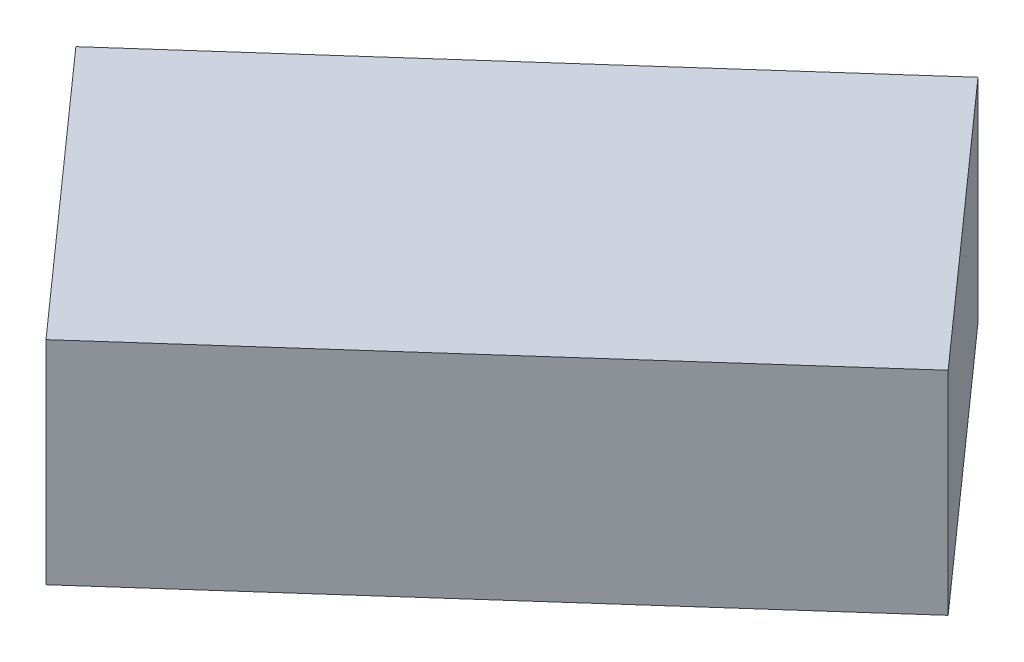
ISO-10303-21;
HEADER;
FILE_DESCRIPTION(('STEP AP214'),'2;1');
FILE_NAME('part.step','',(''),(''),'','','');
FILE_SCHEMA(('AUTOMOTIVE_DESIGN { 1 0 10303 214 1 1 1 1 }'));
ENDSEC;
DATA;
#1=APPLICATION_CONTEXT('core data for automotive mechanical design processes');
#2=APPLICATION_PROTOCOL_DEFINITION('international standard','automotive_design',2000,#1);
#3=PRODUCT_CONTEXT('',#1,'mechanical');
#4=PRODUCT('Part','Part','',(#3));
#5=PRODUCT_RELATED_PRODUCT_CATEGORY('part','',(#4));
#6=PRODUCT_DEFINITION_FORMATION('','',#4);
#7=PRODUCT_DEFINITION_CONTEXT('part definition',#1,'design');
#8=PRODUCT_DEFINITION('design','',#6,#7);
#9=PRODUCT_DEFINITION_SHAPE('','',#8);
#10=(LENGTH_UNIT() NAMED_UNIT(*) SI_UNIT(.MILLI.,.METRE.));
#11=(NAMED_UNIT(*) PLANE_ANGLE_UNIT() SI_UNIT($,.RADIAN.));
#12=(NAMED_UNIT(*) SI_UNIT($,.STERADIAN.) SOLID_ANGLE_UNIT());
#13=UNCERTAINTY_MEASURE_WITH_UNIT(LENGTH_MEASURE(1.E-05),#10,'distance_accuracy_value','');
#14=(GEOMETRIC_REPRESENTATION_CONTEXT(3) GLOBAL_UNCERTAINTY_ASSIGNED_CONTEXT((#13)) GLOBAL_UNIT_ASSIGNED_CONTEXT((#10,
#11,#12)) REPRESENTATION_CONTEXT('',''));
#15=CARTESIAN_POINT('',(0.,0.,0.));
#16=DIRECTION('',(0.,0.,1.));
#17=DIRECTION('',(1.,0.,0.));
#18=AXIS2_PLACEMENT_3D('',#15,#16,#17);
#19=CARTESIAN_POINT('',(95.32,4.,44.735));
#20=DIRECTION('',(0.74740931868366,0.,-0.664363838829919));
#21=DIRECTION('',(-0.664363838829919,0.,-0.74740931868366));
#22=AXIS2_PLACEMENT_3D('',#19,#20,#21);
#23=PLANE('',#22);
#24=DIRECTION('',(0.664363838829919,0.,0.74740931868366));
#25=VECTOR('',#24,1.);
#26=CARTESIAN_POINT('',(95.32,-4.,44.735));
#27=LINE('',#26,#25);
#28=CARTESIAN_POINT('',(95.32,-4.,44.735));
#29=VERTEX_POINT('',#28);
#30=CARTESIAN_POINT('',(98.0069084835102,-4.,47.757772043949));
#31=VERTEX_POINT('',#30);
#32=EDGE_CURVE('E122',#29,#31,#27,.T.);
#33=ORIENTED_EDGE('',*,*,#32,.T.);
#34=DIRECTION('',(0.,1.,0.));
#35=VECTOR('',#34,1.);
#36=CARTESIAN_POINT('',(98.0069084835102,-4.,47.757772043949));
#37=LINE('',#36,#35);
#38=CARTESIAN_POINT('',(98.0069084835102,0.,47.757772043949));
#39=VERTEX_POINT('',#38);
#40=EDGE_CURVE('E110',#31,#39,#37,.T.);
#41=ORIENTED_EDGE('',*,*,#40,.T.);
#42=DIRECTION('',(0.664363838829919,0.,0.74740931868366));
#43=VECTOR('',#42,1.);
#44=CARTESIAN_POINT('',(95.32,0.,44.735));
#45=LINE('',#44,#43);
#46=CARTESIAN_POINT('',(101.99309151649,0.,52.242227956051));
#47=VERTEX_POINT('',#46);
#48=EDGE_CURVE('E11',#39,#47,#45,.T.);
#49=ORIENTED_EDGE('',*,*,#48,.T.);
#50=DIRECTION('',(0.,1.,0.));
#51=VECTOR('',#50,1.);
#52=CARTESIAN_POINT('',(101.99309151649,-4.,52.242227956051));
#53=LINE('',#52,#51);
#54=CARTESIAN_POINT('',(101.99309151649,-4.,52.242227956051));
#55=VERTEX_POINT('',#54);
#56=EDGE_CURVE('E104',#47,#55,#53,.F.);
#57=ORIENTED_EDGE('',*,*,#56,.T.);
#58=CARTESIAN_POINT('',(104.32,-4.,54.86));
#59=VERTEX_POINT('',#58);
#60=EDGE_CURVE('E113',#55,#59,#27,.T.);
#61=ORIENTED_EDGE('',*,*,#60,.T.);
#62=DIRECTION('',(0.,-1.,0.));
#63=VECTOR('',#62,1.);
#64=CARTESIAN_POINT('',(104.32,4.,54.86));
#65=LINE('',#64,#63);
#66=CARTESIAN_POINT('',(104.32,4.,54.86));
#67=VERTEX_POINT('',#66);
#68=EDGE_CURVE('E48',#67,#59,#65,.T.);
#69=ORIENTED_EDGE('',*,*,#68,.F.);
#70=DIRECTION('',(0.664363838829919,0.,0.74740931868366));
#71=VECTOR('',#70,1.);
#72=CARTESIAN_POINT('',(95.32,4.,44.735));
#73=LINE('',#72,#71);
#74=CARTESIAN_POINT('',(95.32,4.,44.735));
#75=VERTEX_POINT('',#74);
#76=EDGE_CURVE('E133',#75,#67,#73,.T.);
#77=ORIENTED_EDGE('',*,*,#76,.F.);
#78=DIRECTION('',(0.,-1.,0.));
#79=VECTOR('',#78,1.);
#80=CARTESIAN_POINT('',(95.32,4.,44.735));
#81=LINE('',#80,#79);
#82=EDGE_CURVE('E134',#75,#29,#81,.T.);
#83=ORIENTED_EDGE('',*,*,#82,.T.);
#84=EDGE_LOOP('',(#33,#41,#49,#57,#61,#69,#77,#83));
#85=FACE_BOUND('',#84,.T.);
#86=ADVANCED_FACE('F41',(#85),#23,.F.);
#87=CARTESIAN_POINT('',(104.32,4.,54.86));
#88=DIRECTION('',(-0.66436383882992,0.,-0.74740931868366));
#89=DIRECTION('',(-0.74740931868366,0.,0.66436383882992));
#90=AXIS2_PLACEMENT_3D('',#87,#88,#89);
#91=PLANE('',#90);
#92=DIRECTION('',(0.74740931868366,0.,-0.66436383882992));
#93=VECTOR('',#92,1.);
#94=CARTESIAN_POINT('',(104.32,-4.,54.86));
#95=LINE('',#94,#93);
#96=CARTESIAN_POINT('',(122.32,-4.,38.86));
#97=VERTEX_POINT('',#96);
#98=EDGE_CURVE('E116',#59,#97,#95,.T.);
#99=ORIENTED_EDGE('',*,*,#98,.T.);
#100=DIRECTION('',(0.,-1.,0.));
#101=VECTOR('',#100,1.);
#102=CARTESIAN_POINT('',(122.32,4.,38.86));
#103=LINE('',#102,#101);
#104=CARTESIAN_POINT('',(122.32,4.,38.86));
#105=VERTEX_POINT('',#104);
#106=EDGE_CURVE('E137',#105,#97,#103,.T.);
#107=ORIENTED_EDGE('',*,*,#106,.F.);
#108=DIRECTION('',(0.74740931868366,0.,-0.66436383882992));
#109=VECTOR('',#108,1.);
#110=CARTESIAN_POINT('',(104.32,4.,54.86));
#111=LINE('',#110,#109);
#112=EDGE_CURVE('E95',#67,#105,#111,.T.);
#113=ORIENTED_EDGE('',*,*,#112,.F.);
#114=ORIENTED_EDGE('',*,*,#68,.T.);
#115=EDGE_LOOP('',(#99,#107,#113,#114));
#116=FACE_BOUND('',#115,.T.);
#117=ADVANCED_FACE('F140',(#116),#91,.F.);
#118=CARTESIAN_POINT('',(122.32,4.,38.86));
#119=DIRECTION('',(-0.74740931868366,0.,0.66436383882992));
#120=DIRECTION('',(0.66436383882992,0.,0.74740931868366));
#121=AXIS2_PLACEMENT_3D('',#118,#119,#120);
#122=PLANE('',#121);
#123=DIRECTION('',(-0.664363838829919,0.,-0.74740931868366));
#124=VECTOR('',#123,1.);
#125=CARTESIAN_POINT('',(122.32,-4.,38.86));
#126=LINE('',#125,#124);
#127=CARTESIAN_POINT('',(113.32,-4.,28.735));
#128=VERTEX_POINT('',#127);
#129=EDGE_CURVE('E126',#97,#128,#126,.T.);
#130=ORIENTED_EDGE('',*,*,#129,.T.);
#131=DIRECTION('',(0.,-1.,0.));
#132=VECTOR('',#131,1.);
#133=CARTESIAN_POINT('',(113.32,4.,28.735));
#134=LINE('',#133,#132);
#135=CARTESIAN_POINT('',(113.32,4.,28.735));
#136=VERTEX_POINT('',#135);
#137=EDGE_CURVE('E135',#136,#128,#134,.T.);
#138=ORIENTED_EDGE('',*,*,#137,.F.);
#139=DIRECTION('',(-0.664363838829919,0.,-0.74740931868366));
#140=VECTOR('',#139,1.);
#141=CARTESIAN_POINT('',(122.32,4.,38.86));
#142=LINE('',#141,#140);
#143=EDGE_CURVE('E143',#105,#136,#142,.T.);
#144=ORIENTED_EDGE('',*,*,#143,.F.);
#145=ORIENTED_EDGE('',*,*,#106,.T.);
#146=EDGE_LOOP('',(#130,#138,#144,#145));
#147=FACE_BOUND('',#146,.T.);
#148=ADVANCED_FACE('F150',(#147),#122,.F.);
#149=CARTESIAN_POINT('',(113.32,4.,28.735));
#150=DIRECTION('',(0.66436383882992,0.,0.74740931868366));
#151=DIRECTION('',(0.74740931868366,0.,-0.66436383882992));
#152=AXIS2_PLACEMENT_3D('',#149,#150,#151);
#153=PLANE('',#152);
#154=DIRECTION('',(-0.74740931868366,0.,0.66436383882992));
#155=VECTOR('',#154,1.);
#156=CARTESIAN_POINT('',(113.32,-4.,28.735));
#157=LINE('',#156,#155);
#158=EDGE_CURVE('E81',#128,#29,#157,.T.);
#159=ORIENTED_EDGE('',*,*,#158,.T.);
#160=ORIENTED_EDGE('',*,*,#82,.F.);
#161=DIRECTION('',(-0.74740931868366,0.,0.66436383882992));
#162=VECTOR('',#161,1.);
#163=CARTESIAN_POINT('',(113.32,4.,28.735));
#164=LINE('',#163,#162);
#165=EDGE_CURVE('E62',#136,#75,#164,.T.);
#166=ORIENTED_EDGE('',*,*,#165,.F.);
#167=ORIENTED_EDGE('',*,*,#137,.T.);
#168=EDGE_LOOP('',(#159,#160,#166,#167));
#169=FACE_BOUND('',#168,.T.);
#170=ADVANCED_FACE('F146',(#169),#153,.F.);
#171=CARTESIAN_POINT('',(0.,4.,0.));
#172=DIRECTION('',(0.,1.,0.));
#173=DIRECTION('',(0.,0.,1.));
#174=AXIS2_PLACEMENT_3D('',#171,#172,#173);
#175=PLANE('',#174);
#176=ORIENTED_EDGE('',*,*,#76,.T.);
#177=ORIENTED_EDGE('',*,*,#112,.T.);
#178=ORIENTED_EDGE('',*,*,#143,.T.);
#179=ORIENTED_EDGE('',*,*,#165,.T.);
#180=EDGE_LOOP('',(#176,#177,#178,#179));
#181=FACE_BOUND('',#180,.T.);
#182=ADVANCED_FACE('F144',(#181),#175,.T.);
#183=CARTESIAN_POINT('',(0.,-4.,0.));
#184=DIRECTION('',(0.,1.,0.));
#185=DIRECTION('',(0.,0.,1.));
#186=AXIS2_PLACEMENT_3D('',#183,#184,#185);
#187=PLANE('',#186);
#188=CARTESIAN_POINT('',(114.,-4.,38.));
#189=DIRECTION('',(0.,1.,0.));
#190=DIRECTION('',(0.,0.,1.));
#191=AXIS2_PLACEMENT_3D('',#188,#189,#190);
#192=CIRCLE('',#191,1.5);
#193=CARTESIAN_POINT('',(114.,-4.,39.5));
#194=VERTEX_POINT('',#193);
#195=EDGE_CURVE('E234',#194,#194,#192,.T.);
#196=ORIENTED_EDGE('',*,*,#195,.T.);
#197=EDGE_LOOP('',(#196));
#198=FACE_BOUND('',#197,.T.);
#199=ORIENTED_EDGE('',*,*,#60,.F.);
#200=CARTESIAN_POINT('',(100.,-4.,50.));
#201=DIRECTION('',(0.,1.,0.));
#202=DIRECTION('',(0.,0.,1.));
#203=AXIS2_PLACEMENT_3D('',#200,#201,#202);
#204=CIRCLE('',#203,3.00000000000001);
#205=EDGE_CURVE('E105',#55,#31,#204,.T.);
#206=ORIENTED_EDGE('',*,*,#205,.T.);
#207=ORIENTED_EDGE('',*,*,#32,.F.);
#208=ORIENTED_EDGE('',*,*,#158,.F.);
#209=ORIENTED_EDGE('',*,*,#129,.F.);
#210=ORIENTED_EDGE('',*,*,#98,.F.);
#211=EDGE_LOOP('',(#199,#206,#207,#208,#209,#210));
#212=FACE_BOUND('',#211,.T.);
#213=ADVANCED_FACE('F117',(#198,#212),#187,.F.);
#214=CARTESIAN_POINT('',(114.,-4.,38.));
#215=DIRECTION('',(0.,1.,0.));
#216=DIRECTION('',(0.,0.,1.));
#217=AXIS2_PLACEMENT_3D('',#214,#215,#216);
#218=CYLINDRICAL_SURFACE('',#217,1.5);
#219=ORIENTED_EDGE('',*,*,#195,.F.);
#220=EDGE_LOOP('',(#219));
#221=FACE_BOUND('',#220,.T.);
#222=CARTESIAN_POINT('',(114.,0.,38.));
#223=DIRECTION('',(0.,1.,0.));
#224=DIRECTION('',(0.,0.,1.));
#225=AXIS2_PLACEMENT_3D('',#222,#223,#224);
#226=CIRCLE('',#225,1.5);
#227=CARTESIAN_POINT('',(114.,0.,39.5));
#228=VERTEX_POINT('',#227);
#229=EDGE_CURVE('E226',#228,#228,#226,.T.);
#230=ORIENTED_EDGE('',*,*,#229,.T.);
#231=EDGE_LOOP('',(#230));
#232=FACE_BOUND('',#231,.T.);
#233=ADVANCED_FACE('F190',(#221,#232),#218,.F.);
#234=CARTESIAN_POINT('',(114.,0.,38.));
#235=DIRECTION('',(0.,1.,0.));
#236=DIRECTION('',(0.,0.,1.));
#237=AXIS2_PLACEMENT_3D('',#234,#235,#236);
#238=PLANE('',#237);
#239=ORIENTED_EDGE('',*,*,#229,.F.);
#240=EDGE_LOOP('',(#239));
#241=FACE_BOUND('',#240,.T.);
#242=ADVANCED_FACE('F196',(#241),#238,.F.);
#243=CARTESIAN_POINT('',(100.,0.,50.));
#244=DIRECTION('',(0.,1.,0.));
#245=DIRECTION('',(0.,0.,1.));
#246=AXIS2_PLACEMENT_3D('',#243,#244,#245);
#247=PLANE('',#246);
#248=CARTESIAN_POINT('',(100.,0.,50.));
#249=DIRECTION('',(0.,1.,0.));
#250=DIRECTION('',(0.,0.,1.));
#251=AXIS2_PLACEMENT_3D('',#248,#249,#250);
#252=CIRCLE('',#251,3.00000000000001);
#253=EDGE_CURVE('E53',#47,#39,#252,.T.);
#254=ORIENTED_EDGE('',*,*,#253,.F.);
#255=ORIENTED_EDGE('',*,*,#48,.F.);
#256=EDGE_LOOP('',(#254,#255));
#257=FACE_BOUND('',#256,.T.);
#258=ADVANCED_FACE('F208',(#257),#247,.F.);
#259=CARTESIAN_POINT('',(100.,-4.,50.));
#260=DIRECTION('',(0.,1.,0.));
#261=DIRECTION('',(0.,0.,1.));
#262=AXIS2_PLACEMENT_3D('',#259,#260,#261);
#263=CYLINDRICAL_SURFACE('',#262,3.00000000000001);
#264=ORIENTED_EDGE('',*,*,#205,.F.);
#265=ORIENTED_EDGE('',*,*,#56,.F.);
#266=ORIENTED_EDGE('',*,*,#253,.T.);
#267=ORIENTED_EDGE('',*,*,#40,.F.);
#268=EDGE_LOOP('',(#264,#265,#266,#267));
#269=FACE_BOUND('',#268,.T.);
#270=ADVANCED_FACE('F102',(#269),#263,.F.);
#271=CLOSED_SHELL('',(#86,#117,#148,#170,#182,#213,#233,#242,#258,#270));
#272=MANIFOLD_SOLID_BREP('B2',#271);
#273=ADVANCED_BREP_SHAPE_REPRESENTATION('',(#18,#272),#14);
#274=SHAPE_DEFINITION_REPRESENTATION(#9,#273);
ENDSEC;
END-ISO-10303-21;
